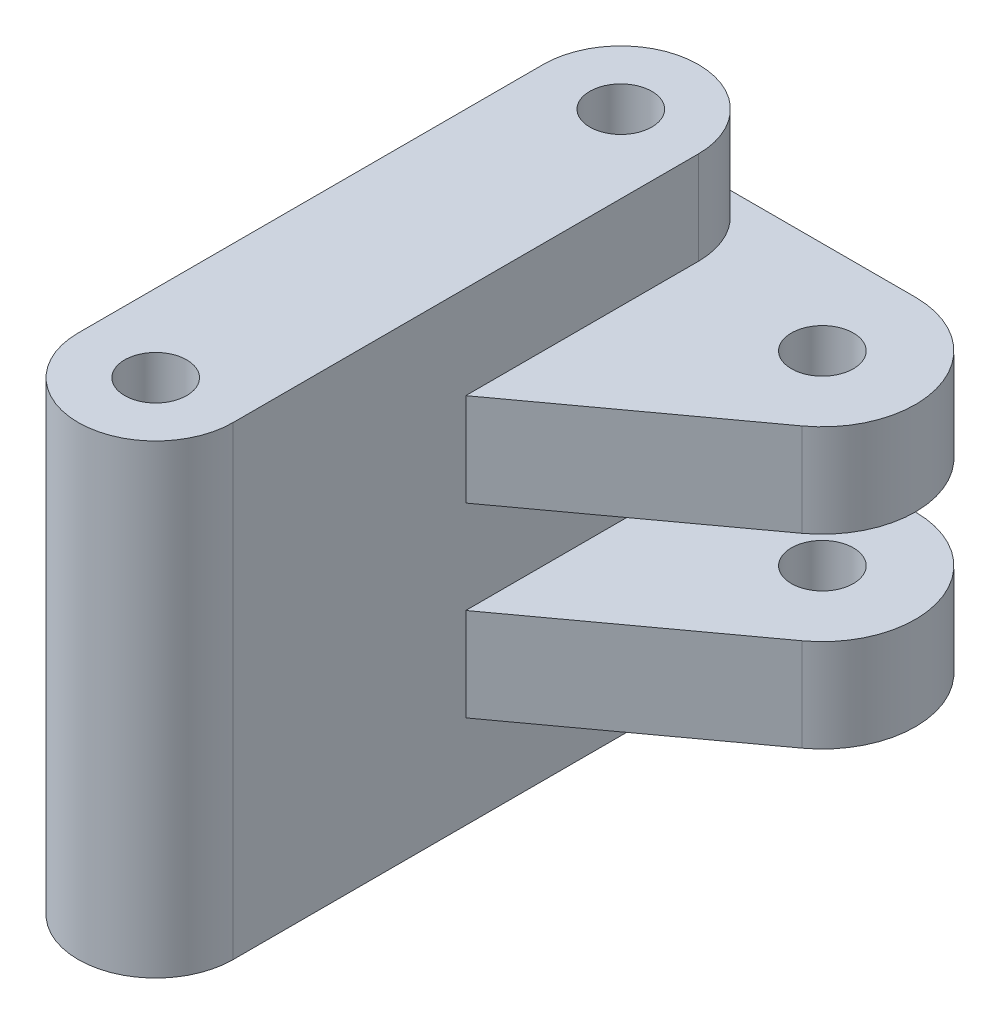
ISO-10303-21;
HEADER;
FILE_DESCRIPTION(('STEP AP214'),'2;1');
FILE_NAME('part.step','',(''),(''),'','','');
FILE_SCHEMA(('AUTOMOTIVE_DESIGN { 1 0 10303 214 1 1 1 1 }'));
ENDSEC;
DATA;
#1=APPLICATION_CONTEXT('core data for automotive mechanical design processes');
#2=APPLICATION_PROTOCOL_DEFINITION('international standard','automotive_design',2000,#1);
#3=PRODUCT_CONTEXT('',#1,'mechanical');
#4=PRODUCT('Part','Part','',(#3));
#5=PRODUCT_RELATED_PRODUCT_CATEGORY('part','',(#4));
#6=PRODUCT_DEFINITION_FORMATION('','',#4);
#7=PRODUCT_DEFINITION_CONTEXT('part definition',#1,'design');
#8=PRODUCT_DEFINITION('design','',#6,#7);
#9=PRODUCT_DEFINITION_SHAPE('','',#8);
#10=(LENGTH_UNIT() NAMED_UNIT(*) SI_UNIT(.MILLI.,.METRE.));
#11=(NAMED_UNIT(*) PLANE_ANGLE_UNIT() SI_UNIT($,.RADIAN.));
#12=(NAMED_UNIT(*) SI_UNIT($,.STERADIAN.) SOLID_ANGLE_UNIT());
#13=UNCERTAINTY_MEASURE_WITH_UNIT(LENGTH_MEASURE(1.E-05),#10,'distance_accuracy_value','');
#14=(GEOMETRIC_REPRESENTATION_CONTEXT(3) GLOBAL_UNCERTAINTY_ASSIGNED_CONTEXT((#13)) GLOBAL_UNIT_ASSIGNED_CONTEXT((#10,
#11,#12)) REPRESENTATION_CONTEXT('',''));
#15=CARTESIAN_POINT('',(0.,0.,0.));
#16=DIRECTION('',(0.,0.,1.));
#17=DIRECTION('',(1.,0.,0.));
#18=AXIS2_PLACEMENT_3D('',#15,#16,#17);
#19=CARTESIAN_POINT('',(2.5,15.,7.5));
#20=DIRECTION('',(-1.,0.,0.));
#21=DIRECTION('',(0.,0.,1.));
#22=AXIS2_PLACEMENT_3D('',#19,#20,#21);
#23=PLANE('',#22);
#24=DIRECTION('',(0.,-1.,0.));
#25=VECTOR('',#24,1.);
#26=CARTESIAN_POINT('',(2.5,12.,0.));
#27=LINE('',#26,#25);
#28=CARTESIAN_POINT('',(2.5,12.,0.));
#29=VERTEX_POINT('',#28);
#30=CARTESIAN_POINT('',(2.5,9.,0.));
#31=VERTEX_POINT('',#30);
#32=EDGE_CURVE('E157',#29,#31,#27,.T.);
#33=ORIENTED_EDGE('',*,*,#32,.F.);
#34=DIRECTION('',(0.,0.,1.));
#35=VECTOR('',#34,1.);
#36=CARTESIAN_POINT('',(2.5,12.,-7.5));
#37=LINE('',#36,#35);
#38=CARTESIAN_POINT('',(2.5,12.,-7.5));
#39=VERTEX_POINT('',#38);
#40=EDGE_CURVE('E142',#39,#29,#37,.T.);
#41=ORIENTED_EDGE('',*,*,#40,.F.);
#42=DIRECTION('',(0.,-1.,0.));
#43=VECTOR('',#42,1.);
#44=CARTESIAN_POINT('',(2.5,15.,-7.5));
#45=LINE('',#44,#43);
#46=CARTESIAN_POINT('',(2.5,15.,-7.5));
#47=VERTEX_POINT('',#46);
#48=EDGE_CURVE('E43',#47,#39,#45,.T.);
#49=ORIENTED_EDGE('',*,*,#48,.F.);
#50=DIRECTION('',(0.,0.,-1.));
#51=VECTOR('',#50,1.);
#52=CARTESIAN_POINT('',(2.5,15.,7.5));
#53=LINE('',#52,#51);
#54=CARTESIAN_POINT('',(2.5,15.,7.5));
#55=VERTEX_POINT('',#54);
#56=EDGE_CURVE('E192',#55,#47,#53,.T.);
#57=ORIENTED_EDGE('',*,*,#56,.F.);
#58=DIRECTION('',(0.,-1.,0.));
#59=VECTOR('',#58,1.);
#60=CARTESIAN_POINT('',(2.5,15.,7.5));
#61=LINE('',#60,#59);
#62=CARTESIAN_POINT('',(2.5,0.,7.5));
#63=VERTEX_POINT('',#62);
#64=EDGE_CURVE('E11',#55,#63,#61,.T.);
#65=ORIENTED_EDGE('',*,*,#64,.T.);
#66=DIRECTION('',(0.,0.,-1.));
#67=VECTOR('',#66,1.);
#68=CARTESIAN_POINT('',(2.5,0.,7.5));
#69=LINE('',#68,#67);
#70=CARTESIAN_POINT('',(2.5,0.,-7.5));
#71=VERTEX_POINT('',#70);
#72=EDGE_CURVE('E184',#63,#71,#69,.T.);
#73=ORIENTED_EDGE('',*,*,#72,.T.);
#74=CARTESIAN_POINT('',(2.5,3.,-7.5));
#75=VERTEX_POINT('',#74);
#76=EDGE_CURVE('E164',#75,#71,#45,.T.);
#77=ORIENTED_EDGE('',*,*,#76,.F.);
#78=DIRECTION('',(0.,0.,1.));
#79=VECTOR('',#78,1.);
#80=CARTESIAN_POINT('',(2.5,3.,-7.5));
#81=LINE('',#80,#79);
#82=CARTESIAN_POINT('',(2.5,3.,0.));
#83=VERTEX_POINT('',#82);
#84=EDGE_CURVE('E238',#75,#83,#81,.T.);
#85=ORIENTED_EDGE('',*,*,#84,.T.);
#86=DIRECTION('',(0.,1.,0.));
#87=VECTOR('',#86,1.);
#88=CARTESIAN_POINT('',(2.5,3.,0.));
#89=LINE('',#88,#87);
#90=CARTESIAN_POINT('',(2.5,6.,0.));
#91=VERTEX_POINT('',#90);
#92=EDGE_CURVE('E208',#83,#91,#89,.T.);
#93=ORIENTED_EDGE('',*,*,#92,.T.);
#94=DIRECTION('',(0.,0.,1.));
#95=VECTOR('',#94,1.);
#96=CARTESIAN_POINT('',(2.5,6.,-7.5));
#97=LINE('',#96,#95);
#98=CARTESIAN_POINT('',(2.5,6.,-7.5));
#99=VERTEX_POINT('',#98);
#100=EDGE_CURVE('E224',#99,#91,#97,.T.);
#101=ORIENTED_EDGE('',*,*,#100,.F.);
#102=CARTESIAN_POINT('',(2.5,9.,-7.5));
#103=VERTEX_POINT('',#102);
#104=EDGE_CURVE('E163',#103,#99,#45,.T.);
#105=ORIENTED_EDGE('',*,*,#104,.F.);
#106=DIRECTION('',(0.,0.,1.));
#107=VECTOR('',#106,1.);
#108=CARTESIAN_POINT('',(2.5,9.,-7.5));
#109=LINE('',#108,#107);
#110=EDGE_CURVE('E261',#103,#31,#109,.T.);
#111=ORIENTED_EDGE('',*,*,#110,.T.);
#112=EDGE_LOOP('',(#33,#41,#49,#57,#65,#73,#77,#85,#93,#101,#105,#111));
#113=FACE_BOUND('',#112,.T.);
#114=ADVANCED_FACE('F35',(#113),#23,.F.);
#115=CARTESIAN_POINT('',(0.,15.,-7.5));
#116=DIRECTION('',(0.,-1.,0.));
#117=DIRECTION('',(0.,0.,-1.));
#118=AXIS2_PLACEMENT_3D('',#115,#116,#117);
#119=CYLINDRICAL_SURFACE('',#118,2.5);
#120=ORIENTED_EDGE('',*,*,#48,.T.);
#121=CARTESIAN_POINT('',(0.,12.,-7.5));
#122=DIRECTION('',(0.,-1.,0.));
#123=DIRECTION('',(0.,0.,1.));
#124=AXIS2_PLACEMENT_3D('',#121,#122,#123);
#125=CIRCLE('',#124,2.5);
#126=CARTESIAN_POINT('',(0.,12.,-10.));
#127=VERTEX_POINT('',#126);
#128=EDGE_CURVE('E138',#127,#39,#125,.T.);
#129=ORIENTED_EDGE('',*,*,#128,.F.);
#130=DIRECTION('',(0.,-1.,0.));
#131=VECTOR('',#130,1.);
#132=CARTESIAN_POINT('',(0.,12.,-10.));
#133=LINE('',#132,#131);
#134=CARTESIAN_POINT('',(0.,9.,-10.));
#135=VERTEX_POINT('',#134);
#136=EDGE_CURVE('E254',#127,#135,#133,.T.);
#137=ORIENTED_EDGE('',*,*,#136,.T.);
#138=CARTESIAN_POINT('',(0.,9.,-7.5));
#139=DIRECTION('',(0.,-1.,0.));
#140=DIRECTION('',(0.,0.,1.));
#141=AXIS2_PLACEMENT_3D('',#138,#139,#140);
#142=CIRCLE('',#141,2.5);
#143=EDGE_CURVE('E50',#135,#103,#142,.T.);
#144=ORIENTED_EDGE('',*,*,#143,.T.);
#145=ORIENTED_EDGE('',*,*,#104,.T.);
#146=CARTESIAN_POINT('',(0.,6.,-7.5));
#147=DIRECTION('',(0.,-1.,0.));
#148=DIRECTION('',(0.,0.,1.));
#149=AXIS2_PLACEMENT_3D('',#146,#147,#148);
#150=CIRCLE('',#149,2.5);
#151=CARTESIAN_POINT('',(0.,6.,-10.));
#152=VERTEX_POINT('',#151);
#153=EDGE_CURVE('E227',#152,#99,#150,.T.);
#154=ORIENTED_EDGE('',*,*,#153,.F.);
#155=DIRECTION('',(0.,1.,0.));
#156=VECTOR('',#155,1.);
#157=CARTESIAN_POINT('',(0.,3.,-10.));
#158=LINE('',#157,#156);
#159=CARTESIAN_POINT('',(0.,3.,-10.));
#160=VERTEX_POINT('',#159);
#161=EDGE_CURVE('E205',#160,#152,#158,.T.);
#162=ORIENTED_EDGE('',*,*,#161,.F.);
#163=CARTESIAN_POINT('',(0.,3.,-7.5));
#164=DIRECTION('',(0.,-1.,0.));
#165=DIRECTION('',(0.,0.,1.));
#166=AXIS2_PLACEMENT_3D('',#163,#164,#165);
#167=CIRCLE('',#166,2.5);
#168=EDGE_CURVE('E218',#160,#75,#167,.T.);
#169=ORIENTED_EDGE('',*,*,#168,.T.);
#170=ORIENTED_EDGE('',*,*,#76,.T.);
#171=CARTESIAN_POINT('',(0.,0.,-7.5));
#172=DIRECTION('',(0.,1.,0.));
#173=DIRECTION('',(0.,0.,1.));
#174=AXIS2_PLACEMENT_3D('',#171,#172,#173);
#175=CIRCLE('',#174,2.5);
#176=CARTESIAN_POINT('',(-2.5,0.,-7.5));
#177=VERTEX_POINT('',#176);
#178=EDGE_CURVE('E182',#71,#177,#175,.T.);
#179=ORIENTED_EDGE('',*,*,#178,.T.);
#180=DIRECTION('',(0.,-1.,0.));
#181=VECTOR('',#180,1.);
#182=CARTESIAN_POINT('',(-2.5,15.,-7.5));
#183=LINE('',#182,#181);
#184=CARTESIAN_POINT('',(-2.5,15.,-7.5));
#185=VERTEX_POINT('',#184);
#186=EDGE_CURVE('E166',#185,#177,#183,.T.);
#187=ORIENTED_EDGE('',*,*,#186,.F.);
#188=CARTESIAN_POINT('',(0.,15.,-7.5));
#189=DIRECTION('',(0.,1.,0.));
#190=DIRECTION('',(0.,0.,1.));
#191=AXIS2_PLACEMENT_3D('',#188,#189,#190);
#192=CIRCLE('',#191,2.5);
#193=EDGE_CURVE('E162',#47,#185,#192,.T.);
#194=ORIENTED_EDGE('',*,*,#193,.F.);
#195=EDGE_LOOP('',(#120,#129,#137,#144,#145,#154,#162,#169,#170,#179,#187,#194));
#196=FACE_BOUND('',#195,.T.);
#197=ADVANCED_FACE('F160',(#196),#119,.T.);
#198=CARTESIAN_POINT('',(0.,15.,7.5));
#199=DIRECTION('',(0.,1.,0.));
#200=DIRECTION('',(0.,0.,1.));
#201=AXIS2_PLACEMENT_3D('',#198,#199,#200);
#202=PLANE('',#201);
#203=CARTESIAN_POINT('',(0.,15.,-7.5));
#204=DIRECTION('',(0.,1.,0.));
#205=DIRECTION('',(0.,0.,1.));
#206=AXIS2_PLACEMENT_3D('',#203,#204,#205);
#207=CIRCLE('',#206,1.);
#208=CARTESIAN_POINT('',(0.,15.,-6.5));
#209=VERTEX_POINT('',#208);
#210=EDGE_CURVE('E189',#209,#209,#207,.T.);
#211=ORIENTED_EDGE('',*,*,#210,.F.);
#212=EDGE_LOOP('',(#211));
#213=FACE_BOUND('',#212,.T.);
#214=CARTESIAN_POINT('',(0.,15.,7.5));
#215=DIRECTION('',(0.,1.,0.));
#216=DIRECTION('',(0.,0.,1.));
#217=AXIS2_PLACEMENT_3D('',#214,#215,#216);
#218=CIRCLE('',#217,2.5);
#219=CARTESIAN_POINT('',(-2.5,15.,7.5));
#220=VERTEX_POINT('',#219);
#221=EDGE_CURVE('E181',#220,#55,#218,.T.);
#222=ORIENTED_EDGE('',*,*,#221,.T.);
#223=ORIENTED_EDGE('',*,*,#56,.T.);
#224=ORIENTED_EDGE('',*,*,#193,.T.);
#225=DIRECTION('',(0.,0.,1.));
#226=VECTOR('',#225,1.);
#227=CARTESIAN_POINT('',(-2.5,15.,7.5));
#228=LINE('',#227,#226);
#229=EDGE_CURVE('E176',#185,#220,#228,.T.);
#230=ORIENTED_EDGE('',*,*,#229,.T.);
#231=EDGE_LOOP('',(#222,#223,#224,#230));
#232=FACE_BOUND('',#231,.T.);
#233=CARTESIAN_POINT('',(0.,15.,7.5));
#234=DIRECTION('',(0.,1.,0.));
#235=DIRECTION('',(0.,0.,1.));
#236=AXIS2_PLACEMENT_3D('',#233,#234,#235);
#237=CIRCLE('',#236,1.);
#238=CARTESIAN_POINT('',(0.,15.,8.5));
#239=VERTEX_POINT('',#238);
#240=EDGE_CURVE('E199',#239,#239,#237,.T.);
#241=ORIENTED_EDGE('',*,*,#240,.F.);
#242=EDGE_LOOP('',(#241));
#243=FACE_BOUND('',#242,.T.);
#244=ADVANCED_FACE('F295',(#213,#232,#243),#202,.T.);
#245=CARTESIAN_POINT('',(0.,0.,7.5));
#246=DIRECTION('',(0.,1.,0.));
#247=DIRECTION('',(0.,0.,1.));
#248=AXIS2_PLACEMENT_3D('',#245,#246,#247);
#249=PLANE('',#248);
#250=CARTESIAN_POINT('',(0.,0.,-7.5));
#251=DIRECTION('',(0.,1.,0.));
#252=DIRECTION('',(0.,0.,1.));
#253=AXIS2_PLACEMENT_3D('',#250,#251,#252);
#254=CIRCLE('',#253,1.);
#255=CARTESIAN_POINT('',(0.,0.,-6.5));
#256=VERTEX_POINT('',#255);
#257=EDGE_CURVE('E196',#256,#256,#254,.T.);
#258=ORIENTED_EDGE('',*,*,#257,.T.);
#259=EDGE_LOOP('',(#258));
#260=FACE_BOUND('',#259,.T.);
#261=CARTESIAN_POINT('',(0.,0.,7.5));
#262=DIRECTION('',(0.,1.,0.));
#263=DIRECTION('',(0.,0.,1.));
#264=AXIS2_PLACEMENT_3D('',#261,#262,#263);
#265=CIRCLE('',#264,2.5);
#266=CARTESIAN_POINT('',(-2.5,0.,7.5));
#267=VERTEX_POINT('',#266);
#268=EDGE_CURVE('E186',#267,#63,#265,.T.);
#269=ORIENTED_EDGE('',*,*,#268,.F.);
#270=DIRECTION('',(0.,0.,1.));
#271=VECTOR('',#270,1.);
#272=CARTESIAN_POINT('',(-2.5,0.,7.5));
#273=LINE('',#272,#271);
#274=EDGE_CURVE('E179',#177,#267,#273,.T.);
#275=ORIENTED_EDGE('',*,*,#274,.F.);
#276=ORIENTED_EDGE('',*,*,#178,.F.);
#277=ORIENTED_EDGE('',*,*,#72,.F.);
#278=EDGE_LOOP('',(#269,#275,#276,#277));
#279=FACE_BOUND('',#278,.T.);
#280=CARTESIAN_POINT('',(0.,0.,7.5));
#281=DIRECTION('',(0.,1.,0.));
#282=DIRECTION('',(0.,0.,1.));
#283=AXIS2_PLACEMENT_3D('',#280,#281,#282);
#284=CIRCLE('',#283,1.);
#285=CARTESIAN_POINT('',(0.,0.,8.5));
#286=VERTEX_POINT('',#285);
#287=EDGE_CURVE('E202',#286,#286,#284,.T.);
#288=ORIENTED_EDGE('',*,*,#287,.T.);
#289=EDGE_LOOP('',(#288));
#290=FACE_BOUND('',#289,.T.);
#291=ADVANCED_FACE('F302',(#260,#279,#290),#249,.F.);
#292=CARTESIAN_POINT('',(0.,15.,7.5));
#293=DIRECTION('',(0.,-1.,0.));
#294=DIRECTION('',(0.,0.,-1.));
#295=AXIS2_PLACEMENT_3D('',#292,#293,#294);
#296=CYLINDRICAL_SURFACE('',#295,2.5);
#297=ORIENTED_EDGE('',*,*,#268,.T.);
#298=ORIENTED_EDGE('',*,*,#64,.F.);
#299=ORIENTED_EDGE('',*,*,#221,.F.);
#300=DIRECTION('',(0.,-1.,0.));
#301=VECTOR('',#300,1.);
#302=CARTESIAN_POINT('',(-2.5,15.,7.5));
#303=LINE('',#302,#301);
#304=EDGE_CURVE('E171',#220,#267,#303,.T.);
#305=ORIENTED_EDGE('',*,*,#304,.T.);
#306=EDGE_LOOP('',(#297,#298,#299,#305));
#307=FACE_BOUND('',#306,.T.);
#308=ADVANCED_FACE('F37',(#307),#296,.T.);
#309=CARTESIAN_POINT('',(-2.5,15.,7.5));
#310=DIRECTION('',(1.,0.,0.));
#311=DIRECTION('',(0.,0.,-1.));
#312=AXIS2_PLACEMENT_3D('',#309,#310,#311);
#313=PLANE('',#312);
#314=ORIENTED_EDGE('',*,*,#274,.T.);
#315=ORIENTED_EDGE('',*,*,#304,.F.);
#316=ORIENTED_EDGE('',*,*,#229,.F.);
#317=ORIENTED_EDGE('',*,*,#186,.T.);
#318=EDGE_LOOP('',(#314,#315,#316,#317));
#319=FACE_BOUND('',#318,.T.);
#320=ADVANCED_FACE('F298',(#319),#313,.F.);
#321=CARTESIAN_POINT('',(0.,15.,-7.5));
#322=DIRECTION('',(0.,-1.,0.));
#323=DIRECTION('',(0.,0.,-1.));
#324=AXIS2_PLACEMENT_3D('',#321,#322,#323);
#325=CYLINDRICAL_SURFACE('',#324,1.);
#326=ORIENTED_EDGE('',*,*,#210,.T.);
#327=EDGE_LOOP('',(#326));
#328=FACE_BOUND('',#327,.T.);
#329=ORIENTED_EDGE('',*,*,#257,.F.);
#330=EDGE_LOOP('',(#329));
#331=FACE_BOUND('',#330,.T.);
#332=ADVANCED_FACE('F301',(#328,#331),#325,.F.);
#333=CARTESIAN_POINT('',(0.,15.,7.5));
#334=DIRECTION('',(0.,-1.,0.));
#335=DIRECTION('',(0.,0.,-1.));
#336=AXIS2_PLACEMENT_3D('',#333,#334,#335);
#337=CYLINDRICAL_SURFACE('',#336,1.);
#338=ORIENTED_EDGE('',*,*,#240,.T.);
#339=EDGE_LOOP('',(#338));
#340=FACE_BOUND('',#339,.T.);
#341=ORIENTED_EDGE('',*,*,#287,.F.);
#342=EDGE_LOOP('',(#341));
#343=FACE_BOUND('',#342,.T.);
#344=ADVANCED_FACE('F311',(#340,#343),#337,.F.);
#345=CARTESIAN_POINT('',(0.,3.,-10.));
#346=DIRECTION('',(0.,0.,-1.));
#347=DIRECTION('',(-1.,0.,0.));
#348=AXIS2_PLACEMENT_3D('',#345,#346,#347);
#349=PLANE('',#348);
#350=DIRECTION('',(-1.,0.,0.));
#351=VECTOR('',#350,1.);
#352=CARTESIAN_POINT('',(0.,6.,-10.));
#353=LINE('',#352,#351);
#354=CARTESIAN_POINT('',(7.,6.,-10.));
#355=VERTEX_POINT('',#354);
#356=EDGE_CURVE('E58',#355,#152,#353,.T.);
#357=ORIENTED_EDGE('',*,*,#356,.F.);
#358=DIRECTION('',(0.,1.,0.));
#359=VECTOR('',#358,1.);
#360=CARTESIAN_POINT('',(7.,3.,-10.));
#361=LINE('',#360,#359);
#362=CARTESIAN_POINT('',(7.,3.,-10.));
#363=VERTEX_POINT('',#362);
#364=EDGE_CURVE('E214',#363,#355,#361,.T.);
#365=ORIENTED_EDGE('',*,*,#364,.F.);
#366=DIRECTION('',(-1.,0.,0.));
#367=VECTOR('',#366,1.);
#368=CARTESIAN_POINT('',(0.,3.,-10.));
#369=LINE('',#368,#367);
#370=EDGE_CURVE('E212',#363,#160,#369,.T.);
#371=ORIENTED_EDGE('',*,*,#370,.T.);
#372=ORIENTED_EDGE('',*,*,#161,.T.);
#373=EDGE_LOOP('',(#357,#365,#371,#372));
#374=FACE_BOUND('',#373,.T.);
#375=ADVANCED_FACE('F315',(#374),#349,.T.);
#376=CARTESIAN_POINT('',(7.,3.,-7.));
#377=DIRECTION('',(0.,1.,0.));
#378=DIRECTION('',(0.,0.,1.));
#379=AXIS2_PLACEMENT_3D('',#376,#377,#378);
#380=CYLINDRICAL_SURFACE('',#379,3.);
#381=CARTESIAN_POINT('',(7.,6.,-7.));
#382=DIRECTION('',(0.,1.,0.));
#383=DIRECTION('',(0.,0.,-1.));
#384=AXIS2_PLACEMENT_3D('',#381,#382,#383);
#385=CIRCLE('',#384,3.);
#386=CARTESIAN_POINT('',(8.76900843770008,6.,-4.57706600433567));
#387=VERTEX_POINT('',#386);
#388=EDGE_CURVE('E219',#387,#355,#385,.T.);
#389=ORIENTED_EDGE('',*,*,#388,.F.);
#390=DIRECTION('',(0.,1.,0.));
#391=VECTOR('',#390,1.);
#392=CARTESIAN_POINT('',(8.76900843770008,3.,-4.57706600433567));
#393=LINE('',#392,#391);
#394=CARTESIAN_POINT('',(8.76900843770008,3.,-4.57706600433567));
#395=VERTEX_POINT('',#394);
#396=EDGE_CURVE('E211',#395,#387,#393,.T.);
#397=ORIENTED_EDGE('',*,*,#396,.F.);
#398=CARTESIAN_POINT('',(7.,3.,-7.));
#399=DIRECTION('',(0.,1.,0.));
#400=DIRECTION('',(0.,0.,-1.));
#401=AXIS2_PLACEMENT_3D('',#398,#399,#400);
#402=CIRCLE('',#401,3.);
#403=EDGE_CURVE('E232',#395,#363,#402,.T.);
#404=ORIENTED_EDGE('',*,*,#403,.T.);
#405=ORIENTED_EDGE('',*,*,#364,.T.);
#406=EDGE_LOOP('',(#389,#397,#404,#405));
#407=FACE_BOUND('',#406,.T.);
#408=ADVANCED_FACE('F321',(#407),#380,.T.);
#409=CARTESIAN_POINT('',(2.5,3.,0.));
#410=DIRECTION('',(0.589669479233359,0.,0.807644665221445));
#411=DIRECTION('',(0.807644665221445,0.,-0.589669479233359));
#412=AXIS2_PLACEMENT_3D('',#409,#410,#411);
#413=PLANE('',#412);
#414=DIRECTION('',(0.807644665221445,0.,-0.589669479233359));
#415=VECTOR('',#414,1.);
#416=CARTESIAN_POINT('',(2.5,6.,0.));
#417=LINE('',#416,#415);
#418=EDGE_CURVE('E221',#91,#387,#417,.T.);
#419=ORIENTED_EDGE('',*,*,#418,.F.);
#420=ORIENTED_EDGE('',*,*,#92,.F.);
#421=DIRECTION('',(0.807644665221445,0.,-0.589669479233359));
#422=VECTOR('',#421,1.);
#423=CARTESIAN_POINT('',(2.5,3.,0.));
#424=LINE('',#423,#422);
#425=EDGE_CURVE('E235',#83,#395,#424,.T.);
#426=ORIENTED_EDGE('',*,*,#425,.T.);
#427=ORIENTED_EDGE('',*,*,#396,.T.);
#428=EDGE_LOOP('',(#419,#420,#426,#427));
#429=FACE_BOUND('',#428,.T.);
#430=ADVANCED_FACE('F317',(#429),#413,.T.);
#431=CARTESIAN_POINT('',(0.,3.,-7.5));
#432=DIRECTION('',(0.,1.,0.));
#433=DIRECTION('',(0.,0.,1.));
#434=AXIS2_PLACEMENT_3D('',#431,#432,#433);
#435=PLANE('',#434);
#436=CARTESIAN_POINT('',(7.,3.,-7.));
#437=DIRECTION('',(0.,1.,0.));
#438=DIRECTION('',(0.,0.,1.));
#439=AXIS2_PLACEMENT_3D('',#436,#437,#438);
#440=CIRCLE('',#439,1.);
#441=CARTESIAN_POINT('',(7.,3.,-6.));
#442=VERTEX_POINT('',#441);
#443=EDGE_CURVE('E229',#442,#442,#440,.T.);
#444=ORIENTED_EDGE('',*,*,#443,.T.);
#445=EDGE_LOOP('',(#444));
#446=FACE_BOUND('',#445,.T.);
#447=ORIENTED_EDGE('',*,*,#168,.F.);
#448=ORIENTED_EDGE('',*,*,#370,.F.);
#449=ORIENTED_EDGE('',*,*,#403,.F.);
#450=ORIENTED_EDGE('',*,*,#425,.F.);
#451=ORIENTED_EDGE('',*,*,#84,.F.);
#452=EDGE_LOOP('',(#447,#448,#449,#450,#451));
#453=FACE_BOUND('',#452,.T.);
#454=ADVANCED_FACE('F320',(#446,#453),#435,.F.);
#455=CARTESIAN_POINT('',(0.,6.,-7.5));
#456=DIRECTION('',(0.,1.,0.));
#457=DIRECTION('',(0.,0.,1.));
#458=AXIS2_PLACEMENT_3D('',#455,#456,#457);
#459=PLANE('',#458);
#460=CARTESIAN_POINT('',(7.,6.,-7.));
#461=DIRECTION('',(0.,1.,0.));
#462=DIRECTION('',(0.,0.,1.));
#463=AXIS2_PLACEMENT_3D('',#460,#461,#462);
#464=CIRCLE('',#463,1.);
#465=CARTESIAN_POINT('',(7.,6.,-6.));
#466=VERTEX_POINT('',#465);
#467=EDGE_CURVE('E242',#466,#466,#464,.T.);
#468=ORIENTED_EDGE('',*,*,#467,.F.);
#469=EDGE_LOOP('',(#468));
#470=FACE_BOUND('',#469,.T.);
#471=ORIENTED_EDGE('',*,*,#153,.T.);
#472=ORIENTED_EDGE('',*,*,#100,.T.);
#473=ORIENTED_EDGE('',*,*,#418,.T.);
#474=ORIENTED_EDGE('',*,*,#388,.T.);
#475=ORIENTED_EDGE('',*,*,#356,.T.);
#476=EDGE_LOOP('',(#471,#472,#473,#474,#475));
#477=FACE_BOUND('',#476,.T.);
#478=ADVANCED_FACE('F287',(#470,#477),#459,.T.);
#479=CARTESIAN_POINT('',(7.,3.,-7.));
#480=DIRECTION('',(0.,1.,0.));
#481=DIRECTION('',(0.,0.,1.));
#482=AXIS2_PLACEMENT_3D('',#479,#480,#481);
#483=CYLINDRICAL_SURFACE('',#482,1.);
#484=ORIENTED_EDGE('',*,*,#443,.F.);
#485=EDGE_LOOP('',(#484));
#486=FACE_BOUND('',#485,.T.);
#487=ORIENTED_EDGE('',*,*,#467,.T.);
#488=EDGE_LOOP('',(#487));
#489=FACE_BOUND('',#488,.T.);
#490=ADVANCED_FACE('F279',(#486,#489),#483,.F.);
#491=CARTESIAN_POINT('',(0.,12.,-7.5));
#492=DIRECTION('',(0.,1.,0.));
#493=DIRECTION('',(0.,0.,1.));
#494=AXIS2_PLACEMENT_3D('',#491,#492,#493);
#495=PLANE('',#494);
#496=ORIENTED_EDGE('',*,*,#128,.T.);
#497=ORIENTED_EDGE('',*,*,#40,.T.);
#498=DIRECTION('',(0.807644665221445,0.,-0.589669479233359));
#499=VECTOR('',#498,1.);
#500=CARTESIAN_POINT('',(2.5,12.,0.));
#501=LINE('',#500,#499);
#502=CARTESIAN_POINT('',(8.76900843770008,12.,-4.57706600433567));
#503=VERTEX_POINT('',#502);
#504=EDGE_CURVE('E158',#29,#503,#501,.T.);
#505=ORIENTED_EDGE('',*,*,#504,.T.);
#506=CARTESIAN_POINT('',(7.,12.,-7.));
#507=DIRECTION('',(0.,1.,0.));
#508=DIRECTION('',(0.,0.,1.));
#509=AXIS2_PLACEMENT_3D('',#506,#507,#508);
#510=CIRCLE('',#509,3.);
#511=CARTESIAN_POINT('',(7.,12.,-10.));
#512=VERTEX_POINT('',#511);
#513=EDGE_CURVE('E266',#503,#512,#510,.T.);
#514=ORIENTED_EDGE('',*,*,#513,.T.);
#515=DIRECTION('',(-1.,0.,0.));
#516=VECTOR('',#515,1.);
#517=CARTESIAN_POINT('',(7.,12.,-10.));
#518=LINE('',#517,#516);
#519=EDGE_CURVE('E145',#512,#127,#518,.T.);
#520=ORIENTED_EDGE('',*,*,#519,.T.);
#521=EDGE_LOOP('',(#496,#497,#505,#514,#520));
#522=FACE_BOUND('',#521,.T.);
#523=CARTESIAN_POINT('',(7.,12.,-7.));
#524=DIRECTION('',(0.,1.,0.));
#525=DIRECTION('',(0.,0.,1.));
#526=AXIS2_PLACEMENT_3D('',#523,#524,#525);
#527=CIRCLE('',#526,1.);
#528=CARTESIAN_POINT('',(7.,12.,-6.));
#529=VERTEX_POINT('',#528);
#530=EDGE_CURVE('E264',#529,#529,#527,.T.);
#531=ORIENTED_EDGE('',*,*,#530,.F.);
#532=EDGE_LOOP('',(#531));
#533=FACE_BOUND('',#532,.T.);
#534=ADVANCED_FACE('F140',(#522,#533),#495,.T.);
#535=CARTESIAN_POINT('',(0.,9.,-7.5));
#536=DIRECTION('',(0.,1.,0.));
#537=DIRECTION('',(0.,0.,1.));
#538=AXIS2_PLACEMENT_3D('',#535,#536,#537);
#539=PLANE('',#538);
#540=ORIENTED_EDGE('',*,*,#143,.F.);
#541=DIRECTION('',(-1.,0.,0.));
#542=VECTOR('',#541,1.);
#543=CARTESIAN_POINT('',(7.,9.,-10.));
#544=LINE('',#543,#542);
#545=CARTESIAN_POINT('',(7.,9.,-10.));
#546=VERTEX_POINT('',#545);
#547=EDGE_CURVE('E150',#546,#135,#544,.T.);
#548=ORIENTED_EDGE('',*,*,#547,.F.);
#549=CARTESIAN_POINT('',(7.,9.,-7.));
#550=DIRECTION('',(0.,1.,0.));
#551=DIRECTION('',(0.,0.,1.));
#552=AXIS2_PLACEMENT_3D('',#549,#550,#551);
#553=CIRCLE('',#552,3.);
#554=CARTESIAN_POINT('',(8.76900843770008,9.,-4.57706600433567));
#555=VERTEX_POINT('',#554);
#556=EDGE_CURVE('E257',#555,#546,#553,.T.);
#557=ORIENTED_EDGE('',*,*,#556,.F.);
#558=DIRECTION('',(0.807644665221445,0.,-0.589669479233359));
#559=VECTOR('',#558,1.);
#560=CARTESIAN_POINT('',(2.5,9.,0.));
#561=LINE('',#560,#559);
#562=EDGE_CURVE('E259',#31,#555,#561,.T.);
#563=ORIENTED_EDGE('',*,*,#562,.F.);
#564=ORIENTED_EDGE('',*,*,#110,.F.);
#565=EDGE_LOOP('',(#540,#548,#557,#563,#564));
#566=FACE_BOUND('',#565,.T.);
#567=CARTESIAN_POINT('',(7.,9.,-7.));
#568=DIRECTION('',(0.,1.,0.));
#569=DIRECTION('',(0.,0.,1.));
#570=AXIS2_PLACEMENT_3D('',#567,#568,#569);
#571=CIRCLE('',#570,1.);
#572=CARTESIAN_POINT('',(7.,9.,-6.));
#573=VERTEX_POINT('',#572);
#574=EDGE_CURVE('E269',#573,#573,#571,.T.);
#575=ORIENTED_EDGE('',*,*,#574,.T.);
#576=EDGE_LOOP('',(#575));
#577=FACE_BOUND('',#576,.T.);
#578=ADVANCED_FACE('F278',(#566,#577),#539,.F.);
#579=CARTESIAN_POINT('',(2.5,12.,0.));
#580=DIRECTION('',(-0.589669479233359,0.,-0.807644665221445));
#581=DIRECTION('',(-0.807644665221445,0.,0.589669479233359));
#582=AXIS2_PLACEMENT_3D('',#579,#580,#581);
#583=PLANE('',#582);
#584=ORIENTED_EDGE('',*,*,#562,.T.);
#585=DIRECTION('',(0.,-1.,0.));
#586=VECTOR('',#585,1.);
#587=CARTESIAN_POINT('',(8.76900843770008,12.,-4.57706600433567));
#588=LINE('',#587,#586);
#589=EDGE_CURVE('E248',#503,#555,#588,.T.);
#590=ORIENTED_EDGE('',*,*,#589,.F.);
#591=ORIENTED_EDGE('',*,*,#504,.F.);
#592=ORIENTED_EDGE('',*,*,#32,.T.);
#593=EDGE_LOOP('',(#584,#590,#591,#592));
#594=FACE_BOUND('',#593,.T.);
#595=ADVANCED_FACE('F285',(#594),#583,.F.);
#596=CARTESIAN_POINT('',(7.,12.,-7.));
#597=DIRECTION('',(0.,-1.,0.));
#598=DIRECTION('',(0.,0.,-1.));
#599=AXIS2_PLACEMENT_3D('',#596,#597,#598);
#600=CYLINDRICAL_SURFACE('',#599,3.);
#601=ORIENTED_EDGE('',*,*,#556,.T.);
#602=DIRECTION('',(0.,-1.,0.));
#603=VECTOR('',#602,1.);
#604=CARTESIAN_POINT('',(7.,12.,-10.));
#605=LINE('',#604,#603);
#606=EDGE_CURVE('E251',#512,#546,#605,.T.);
#607=ORIENTED_EDGE('',*,*,#606,.F.);
#608=ORIENTED_EDGE('',*,*,#513,.F.);
#609=ORIENTED_EDGE('',*,*,#589,.T.);
#610=EDGE_LOOP('',(#601,#607,#608,#609));
#611=FACE_BOUND('',#610,.T.);
#612=ADVANCED_FACE('F337',(#611),#600,.T.);
#613=CARTESIAN_POINT('',(7.,12.,-10.));
#614=DIRECTION('',(0.,0.,1.));
#615=DIRECTION('',(1.,0.,0.));
#616=AXIS2_PLACEMENT_3D('',#613,#614,#615);
#617=PLANE('',#616);
#618=ORIENTED_EDGE('',*,*,#547,.T.);
#619=ORIENTED_EDGE('',*,*,#136,.F.);
#620=ORIENTED_EDGE('',*,*,#519,.F.);
#621=ORIENTED_EDGE('',*,*,#606,.T.);
#622=EDGE_LOOP('',(#618,#619,#620,#621));
#623=FACE_BOUND('',#622,.T.);
#624=ADVANCED_FACE('F341',(#623),#617,.F.);
#625=CARTESIAN_POINT('',(7.,12.,-7.));
#626=DIRECTION('',(0.,-1.,0.));
#627=DIRECTION('',(0.,0.,-1.));
#628=AXIS2_PLACEMENT_3D('',#625,#626,#627);
#629=CYLINDRICAL_SURFACE('',#628,1.);
#630=ORIENTED_EDGE('',*,*,#530,.T.);
#631=EDGE_LOOP('',(#630));
#632=FACE_BOUND('',#631,.T.);
#633=ORIENTED_EDGE('',*,*,#574,.F.);
#634=EDGE_LOOP('',(#633));
#635=FACE_BOUND('',#634,.T.);
#636=ADVANCED_FACE('F275',(#632,#635),#629,.F.);
#637=CLOSED_SHELL('',(#114,#197,#244,#291,#308,#320,#332,#344,#375,#408,#430,#454,#478,#490,
#534,#578,#595,#612,#624,#636));
#638=MANIFOLD_SOLID_BREP('B2',#637);
#639=ADVANCED_BREP_SHAPE_REPRESENTATION('',(#18,#638),#14);
#640=SHAPE_DEFINITION_REPRESENTATION(#9,#639);
ENDSEC;
END-ISO-10303-21;
